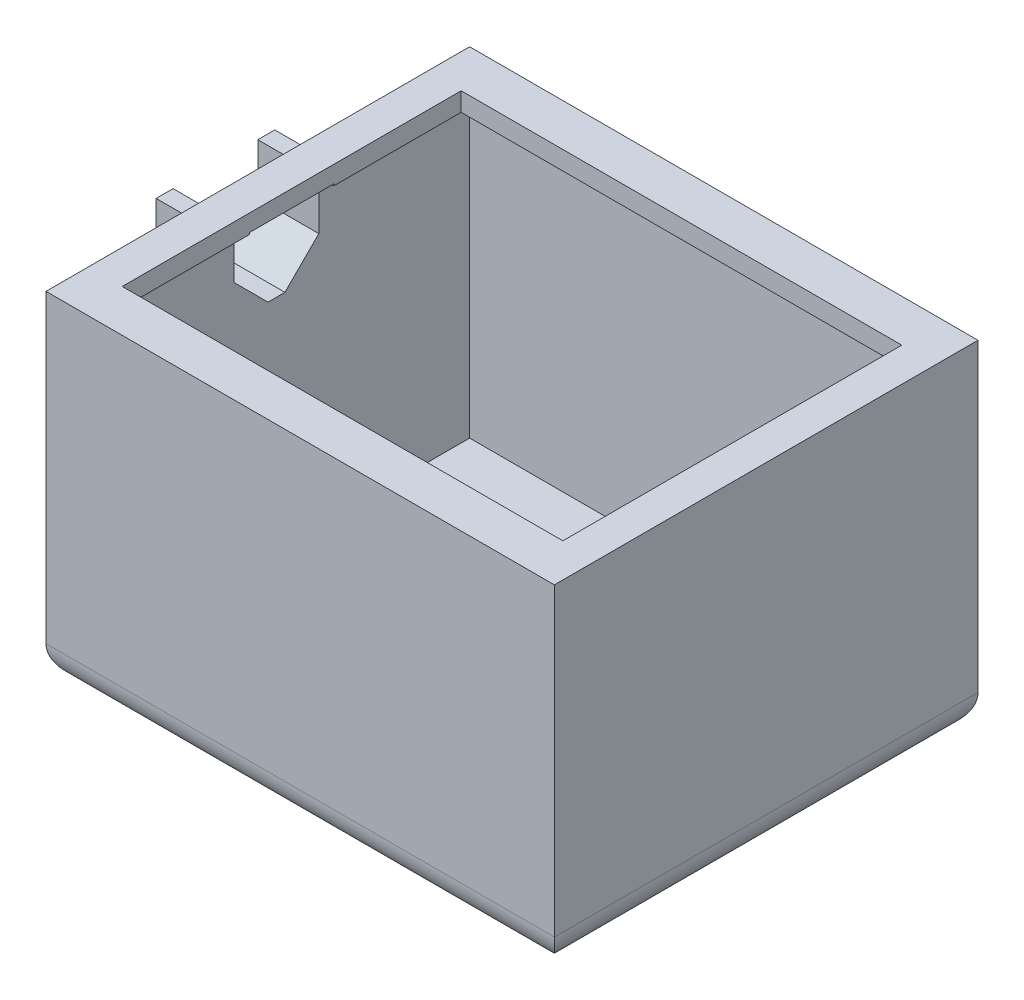
ISO-10303-21;
HEADER;
FILE_DESCRIPTION(('STEP AP214'),'2;1');
FILE_NAME('part.step','',(''),(''),'','','');
FILE_SCHEMA(('AUTOMOTIVE_DESIGN { 1 0 10303 214 1 1 1 1 }'));
ENDSEC;
DATA;
#1=APPLICATION_CONTEXT('core data for automotive mechanical design processes');
#2=APPLICATION_PROTOCOL_DEFINITION('international standard','automotive_design',2000,#1);
#3=PRODUCT_CONTEXT('',#1,'mechanical');
#4=PRODUCT('Part','Part','',(#3));
#5=PRODUCT_RELATED_PRODUCT_CATEGORY('part','',(#4));
#6=PRODUCT_DEFINITION_FORMATION('','',#4);
#7=PRODUCT_DEFINITION_CONTEXT('part definition',#1,'design');
#8=PRODUCT_DEFINITION('design','',#6,#7);
#9=PRODUCT_DEFINITION_SHAPE('','',#8);
#10=(LENGTH_UNIT() NAMED_UNIT(*) SI_UNIT(.MILLI.,.METRE.));
#11=(NAMED_UNIT(*) PLANE_ANGLE_UNIT() SI_UNIT($,.RADIAN.));
#12=(NAMED_UNIT(*) SI_UNIT($,.STERADIAN.) SOLID_ANGLE_UNIT());
#13=UNCERTAINTY_MEASURE_WITH_UNIT(LENGTH_MEASURE(1.E-05),#10,'distance_accuracy_value','');
#14=(GEOMETRIC_REPRESENTATION_CONTEXT(3) GLOBAL_UNCERTAINTY_ASSIGNED_CONTEXT((#13)) GLOBAL_UNIT_ASSIGNED_CONTEXT((#10,
#11,#12)) REPRESENTATION_CONTEXT('',''));
#15=CARTESIAN_POINT('',(0.,0.,0.));
#16=DIRECTION('',(0.,0.,1.));
#17=DIRECTION('',(1.,0.,0.));
#18=AXIS2_PLACEMENT_3D('',#15,#16,#17);
#19=CARTESIAN_POINT('',(-27.8,40.,-25.));
#20=DIRECTION('',(1.,0.,0.));
#21=DIRECTION('',(0.,0.,-1.));
#22=AXIS2_PLACEMENT_3D('',#19,#20,#21);
#23=PLANE('',#22);
#24=DIRECTION('',(0.,-1.,0.));
#25=VECTOR('',#24,1.);
#26=CARTESIAN_POINT('',(-27.8,40.,-4.99999999999999));
#27=LINE('',#26,#25);
#28=CARTESIAN_POINT('',(-27.8,37.8,-5.));
#29=VERTEX_POINT('',#28);
#30=CARTESIAN_POINT('',(-27.8,32.,-4.99999999999999));
#31=VERTEX_POINT('',#30);
#32=EDGE_CURVE('E317',#29,#31,#27,.T.);
#33=ORIENTED_EDGE('',*,*,#32,.T.);
#34=DIRECTION('',(0.,0.707106781186545,-0.70710678118655));
#35=VECTOR('',#34,1.);
#36=CARTESIAN_POINT('',(-27.8,28.,-0.999999999999965));
#37=LINE('',#36,#35);
#38=CARTESIAN_POINT('',(-27.8,28.,-0.999999999999963));
#39=VERTEX_POINT('',#38);
#40=EDGE_CURVE('E476',#31,#39,#37,.F.);
#41=ORIENTED_EDGE('',*,*,#40,.T.);
#42=DIRECTION('',(0.,0.,1.));
#43=VECTOR('',#42,1.);
#44=CARTESIAN_POINT('',(-27.8,28.,-25.));
#45=LINE('',#44,#43);
#46=CARTESIAN_POINT('',(-27.8,28.,1.));
#47=VERTEX_POINT('',#46);
#48=EDGE_CURVE('E321',#39,#47,#45,.T.);
#49=ORIENTED_EDGE('',*,*,#48,.T.);
#50=DIRECTION('',(0.,-0.707106781186551,-0.707106781186544));
#51=VECTOR('',#50,1.);
#52=CARTESIAN_POINT('',(-27.8,32.,5.));
#53=LINE('',#52,#51);
#54=CARTESIAN_POINT('',(-27.8,32.,5.));
#55=VERTEX_POINT('',#54);
#56=EDGE_CURVE('E482',#47,#55,#53,.F.);
#57=ORIENTED_EDGE('',*,*,#56,.T.);
#58=DIRECTION('',(0.,1.,0.));
#59=VECTOR('',#58,1.);
#60=CARTESIAN_POINT('',(-27.8,40.,5.));
#61=LINE('',#60,#59);
#62=CARTESIAN_POINT('',(-27.8,37.8,5.));
#63=VERTEX_POINT('',#62);
#64=EDGE_CURVE('E332',#55,#63,#61,.T.);
#65=ORIENTED_EDGE('',*,*,#64,.T.);
#66=DIRECTION('',(0.,0.,1.));
#67=VECTOR('',#66,1.);
#68=CARTESIAN_POINT('',(-27.8,37.8,-25.));
#69=LINE('',#68,#67);
#70=CARTESIAN_POINT('',(-27.8,37.8,22.8));
#71=VERTEX_POINT('',#70);
#72=EDGE_CURVE('E398',#63,#71,#69,.T.);
#73=ORIENTED_EDGE('',*,*,#72,.T.);
#74=DIRECTION('',(0.,-1.,0.));
#75=VECTOR('',#74,1.);
#76=CARTESIAN_POINT('',(-27.8,40.,22.8));
#77=LINE('',#76,#75);
#78=CARTESIAN_POINT('',(-27.8,2.2,22.8));
#79=VERTEX_POINT('',#78);
#80=EDGE_CURVE('E406',#71,#79,#77,.T.);
#81=ORIENTED_EDGE('',*,*,#80,.T.);
#82=DIRECTION('',(0.,0.,1.));
#83=VECTOR('',#82,1.);
#84=CARTESIAN_POINT('',(-27.8,2.2,-25.));
#85=LINE('',#84,#83);
#86=CARTESIAN_POINT('',(-27.8,2.2,-22.8));
#87=VERTEX_POINT('',#86);
#88=EDGE_CURVE('E417',#87,#79,#85,.T.);
#89=ORIENTED_EDGE('',*,*,#88,.F.);
#90=DIRECTION('',(0.,-1.,0.));
#91=VECTOR('',#90,1.);
#92=CARTESIAN_POINT('',(-27.8,40.,-22.8));
#93=LINE('',#92,#91);
#94=CARTESIAN_POINT('',(-27.8,37.8,-22.8));
#95=VERTEX_POINT('',#94);
#96=EDGE_CURVE('E413',#95,#87,#93,.T.);
#97=ORIENTED_EDGE('',*,*,#96,.F.);
#98=EDGE_CURVE('E394',#95,#29,#69,.T.);
#99=ORIENTED_EDGE('',*,*,#98,.T.);
#100=EDGE_LOOP('',(#33,#41,#49,#57,#65,#73,#81,#89,#97,#99));
#101=FACE_BOUND('',#100,.T.);
#102=ADVANCED_FACE('F41',(#101),#23,.T.);
#103=CARTESIAN_POINT('',(0.,37.8,0.));
#104=DIRECTION('',(0.,1.,0.));
#105=DIRECTION('',(0.,0.,1.));
#106=AXIS2_PLACEMENT_3D('',#103,#104,#105);
#107=PLANE('',#106);
#108=DIRECTION('',(-1.,0.,0.));
#109=VECTOR('',#108,1.);
#110=CARTESIAN_POINT('',(0.,37.8,5.));
#111=LINE('',#110,#109);
#112=CARTESIAN_POINT('',(-26.,37.8,5.00000000000001));
#113=VERTEX_POINT('',#112);
#114=EDGE_CURVE('E328',#113,#63,#111,.T.);
#115=ORIENTED_EDGE('',*,*,#114,.F.);
#116=DIRECTION('',(0.,0.,1.));
#117=VECTOR('',#116,1.);
#118=CARTESIAN_POINT('',(-26.,37.8,0.));
#119=LINE('',#118,#117);
#120=CARTESIAN_POINT('',(-26.,37.8,20.));
#121=VERTEX_POINT('',#120);
#122=EDGE_CURVE('E437',#113,#121,#119,.T.);
#123=ORIENTED_EDGE('',*,*,#122,.T.);
#124=DIRECTION('',(1.,0.,0.));
#125=VECTOR('',#124,1.);
#126=CARTESIAN_POINT('',(0.,37.8,20.));
#127=LINE('',#126,#125);
#128=CARTESIAN_POINT('',(26.,37.8,20.));
#129=VERTEX_POINT('',#128);
#130=EDGE_CURVE('E442',#121,#129,#127,.T.);
#131=ORIENTED_EDGE('',*,*,#130,.T.);
#132=DIRECTION('',(0.,0.,-1.));
#133=VECTOR('',#132,1.);
#134=CARTESIAN_POINT('',(26.,37.8,0.));
#135=LINE('',#134,#133);
#136=CARTESIAN_POINT('',(26.,37.8,-20.));
#137=VERTEX_POINT('',#136);
#138=EDGE_CURVE('E446',#129,#137,#135,.T.);
#139=ORIENTED_EDGE('',*,*,#138,.T.);
#140=DIRECTION('',(-1.,0.,0.));
#141=VECTOR('',#140,1.);
#142=CARTESIAN_POINT('',(0.,37.8,-20.));
#143=LINE('',#142,#141);
#144=CARTESIAN_POINT('',(-26.,37.8,-20.));
#145=VERTEX_POINT('',#144);
#146=EDGE_CURVE('E393',#137,#145,#143,.T.);
#147=ORIENTED_EDGE('',*,*,#146,.T.);
#148=CARTESIAN_POINT('',(-26.,37.8,-4.99999999999999));
#149=VERTEX_POINT('',#148);
#150=EDGE_CURVE('E438',#145,#149,#119,.T.);
#151=ORIENTED_EDGE('',*,*,#150,.T.);
#152=DIRECTION('',(1.,0.,0.));
#153=VECTOR('',#152,1.);
#154=CARTESIAN_POINT('',(0.,37.8,-5.));
#155=LINE('',#154,#153);
#156=EDGE_CURVE('E314',#29,#149,#155,.T.);
#157=ORIENTED_EDGE('',*,*,#156,.F.);
#158=ORIENTED_EDGE('',*,*,#98,.F.);
#159=DIRECTION('',(-1.,0.,0.));
#160=VECTOR('',#159,1.);
#161=CARTESIAN_POINT('',(-30.,37.8,-22.8));
#162=LINE('',#161,#160);
#163=CARTESIAN_POINT('',(27.8,37.8,-22.8));
#164=VERTEX_POINT('',#163);
#165=EDGE_CURVE('E399',#164,#95,#162,.T.);
#166=ORIENTED_EDGE('',*,*,#165,.F.);
#167=DIRECTION('',(0.,0.,-1.));
#168=VECTOR('',#167,1.);
#169=CARTESIAN_POINT('',(27.8,37.8,-25.));
#170=LINE('',#169,#168);
#171=CARTESIAN_POINT('',(27.8,37.8,22.8));
#172=VERTEX_POINT('',#171);
#173=EDGE_CURVE('E402',#172,#164,#170,.T.);
#174=ORIENTED_EDGE('',*,*,#173,.F.);
#175=DIRECTION('',(1.,0.,0.));
#176=VECTOR('',#175,1.);
#177=CARTESIAN_POINT('',(-30.,37.8,22.8));
#178=LINE('',#177,#176);
#179=EDGE_CURVE('E390',#71,#172,#178,.T.);
#180=ORIENTED_EDGE('',*,*,#179,.F.);
#181=ORIENTED_EDGE('',*,*,#72,.F.);
#182=EDGE_LOOP('',(#115,#123,#131,#139,#147,#151,#157,#158,#166,#174,#180,#181));
#183=FACE_BOUND('',#182,.T.);
#184=ADVANCED_FACE('F562',(#183),#107,.F.);
#185=CARTESIAN_POINT('',(-26.,30.,-20.));
#186=DIRECTION('',(-1.,0.,0.));
#187=DIRECTION('',(0.,0.,1.));
#188=AXIS2_PLACEMENT_3D('',#185,#186,#187);
#189=PLANE('',#188);
#190=DIRECTION('',(0.,-1.,0.));
#191=VECTOR('',#190,1.);
#192=CARTESIAN_POINT('',(-26.,30.,5.));
#193=LINE('',#192,#191);
#194=CARTESIAN_POINT('',(-26.,38.,5.));
#195=VERTEX_POINT('',#194);
#196=EDGE_CURVE('E325',#195,#113,#193,.T.);
#197=ORIENTED_EDGE('',*,*,#196,.F.);
#198=DIRECTION('',(0.,0.,1.));
#199=VECTOR('',#198,1.);
#200=CARTESIAN_POINT('',(-26.,38.,-20.));
#201=LINE('',#200,#199);
#202=CARTESIAN_POINT('',(-26.,38.,-5.));
#203=VERTEX_POINT('',#202);
#204=EDGE_CURVE('E307',#203,#195,#201,.T.);
#205=ORIENTED_EDGE('',*,*,#204,.F.);
#206=DIRECTION('',(0.,1.,0.));
#207=VECTOR('',#206,1.);
#208=CARTESIAN_POINT('',(-26.,30.,-5.));
#209=LINE('',#208,#207);
#210=EDGE_CURVE('E310',#149,#203,#209,.T.);
#211=ORIENTED_EDGE('',*,*,#210,.F.);
#212=ORIENTED_EDGE('',*,*,#150,.F.);
#213=DIRECTION('',(0.,1.,0.));
#214=VECTOR('',#213,1.);
#215=CARTESIAN_POINT('',(-26.,30.,-20.));
#216=LINE('',#215,#214);
#217=CARTESIAN_POINT('',(-26.,40.,-20.));
#218=VERTEX_POINT('',#217);
#219=EDGE_CURVE('E358',#145,#218,#216,.T.);
#220=ORIENTED_EDGE('',*,*,#219,.T.);
#221=DIRECTION('',(0.,0.,1.));
#222=VECTOR('',#221,1.);
#223=CARTESIAN_POINT('',(-26.,40.,-20.));
#224=LINE('',#223,#222);
#225=CARTESIAN_POINT('',(-26.,40.,20.));
#226=VERTEX_POINT('',#225);
#227=EDGE_CURVE('E342',#218,#226,#224,.T.);
#228=ORIENTED_EDGE('',*,*,#227,.T.);
#229=DIRECTION('',(0.,1.,0.));
#230=VECTOR('',#229,1.);
#231=CARTESIAN_POINT('',(-26.,30.,20.));
#232=LINE('',#231,#230);
#233=EDGE_CURVE('E355',#121,#226,#232,.T.);
#234=ORIENTED_EDGE('',*,*,#233,.F.);
#235=ORIENTED_EDGE('',*,*,#122,.F.);
#236=EDGE_LOOP('',(#197,#205,#211,#212,#220,#228,#234,#235));
#237=FACE_BOUND('',#236,.T.);
#238=ADVANCED_FACE('F568',(#237),#189,.F.);
#239=CARTESIAN_POINT('',(-30.,40.,-25.));
#240=DIRECTION('',(1.,0.,0.));
#241=DIRECTION('',(0.,0.,-1.));
#242=AXIS2_PLACEMENT_3D('',#239,#240,#241);
#243=PLANE('',#242);
#244=DIRECTION('',(0.,-1.,0.));
#245=VECTOR('',#244,1.);
#246=CARTESIAN_POINT('',(-30.,40.,-25.));
#247=LINE('',#246,#245);
#248=CARTESIAN_POINT('',(-30.,40.,-25.));
#249=VERTEX_POINT('',#248);
#250=CARTESIAN_POINT('',(-30.,4.,-25.));
#251=VERTEX_POINT('',#250);
#252=EDGE_CURVE('E382',#249,#251,#247,.T.);
#253=ORIENTED_EDGE('',*,*,#252,.T.);
#254=DIRECTION('',(0.,0.,1.));
#255=VECTOR('',#254,1.);
#256=CARTESIAN_POINT('',(-30.,4.,-25.));
#257=LINE('',#256,#255);
#258=CARTESIAN_POINT('',(-30.,4.,25.));
#259=VERTEX_POINT('',#258);
#260=EDGE_CURVE('E51',#251,#259,#257,.T.);
#261=ORIENTED_EDGE('',*,*,#260,.T.);
#262=DIRECTION('',(0.,-1.,0.));
#263=VECTOR('',#262,1.);
#264=CARTESIAN_POINT('',(-30.,40.,25.));
#265=LINE('',#264,#263);
#266=CARTESIAN_POINT('',(-30.,40.,25.));
#267=VERTEX_POINT('',#266);
#268=EDGE_CURVE('E379',#267,#259,#265,.T.);
#269=ORIENTED_EDGE('',*,*,#268,.F.);
#270=DIRECTION('',(0.,0.,1.));
#271=VECTOR('',#270,1.);
#272=CARTESIAN_POINT('',(-30.,40.,-25.));
#273=LINE('',#272,#271);
#274=EDGE_CURVE('E370',#249,#267,#273,.T.);
#275=ORIENTED_EDGE('',*,*,#274,.F.);
#276=EDGE_LOOP('',(#253,#261,#269,#275));
#277=FACE_BOUND('',#276,.T.);
#278=DIRECTION('',(0.,0.,-1.));
#279=VECTOR('',#278,1.);
#280=CARTESIAN_POINT('',(-30.,21.,-25.));
#281=LINE('',#280,#279);
#282=CARTESIAN_POINT('',(-30.,21.,7.00000000000001));
#283=VERTEX_POINT('',#282);
#284=CARTESIAN_POINT('',(-30.,21.,-6.99999999999999));
#285=VERTEX_POINT('',#284);
#286=EDGE_CURVE('E450',#283,#285,#281,.T.);
#287=ORIENTED_EDGE('',*,*,#286,.T.);
#288=DIRECTION('',(0.,1.,0.));
#289=VECTOR('',#288,1.);
#290=CARTESIAN_POINT('',(-30.,26.,-6.99999999999999));
#291=LINE('',#290,#289);
#292=CARTESIAN_POINT('',(-30.,38.,-6.99999999999999));
#293=VERTEX_POINT('',#292);
#294=EDGE_CURVE('E281',#285,#293,#291,.T.);
#295=ORIENTED_EDGE('',*,*,#294,.T.);
#296=DIRECTION('',(0.,0.,1.));
#297=VECTOR('',#296,1.);
#298=CARTESIAN_POINT('',(-30.,38.,-6.99999999999999));
#299=LINE('',#298,#297);
#300=CARTESIAN_POINT('',(-30.,38.,-4.99999999999999));
#301=VERTEX_POINT('',#300);
#302=EDGE_CURVE('E236',#293,#301,#299,.T.);
#303=ORIENTED_EDGE('',*,*,#302,.T.);
#304=DIRECTION('',(0.,0.,1.));
#305=VECTOR('',#304,1.);
#306=CARTESIAN_POINT('',(-30.,38.,-4.99999999999999));
#307=LINE('',#306,#305);
#308=CARTESIAN_POINT('',(-30.,38.,5.));
#309=VERTEX_POINT('',#308);
#310=EDGE_CURVE('E291',#301,#309,#307,.T.);
#311=ORIENTED_EDGE('',*,*,#310,.T.);
#312=DIRECTION('',(0.,0.,1.));
#313=VECTOR('',#312,1.);
#314=CARTESIAN_POINT('',(-30.,38.,5.));
#315=LINE('',#314,#313);
#316=CARTESIAN_POINT('',(-30.,38.,7.00000000000001));
#317=VERTEX_POINT('',#316);
#318=EDGE_CURVE('E242',#309,#317,#315,.T.);
#319=ORIENTED_EDGE('',*,*,#318,.T.);
#320=DIRECTION('',(0.,-1.,0.));
#321=VECTOR('',#320,1.);
#322=CARTESIAN_POINT('',(-30.,38.,7.00000000000001));
#323=LINE('',#322,#321);
#324=EDGE_CURVE('E278',#317,#283,#323,.T.);
#325=ORIENTED_EDGE('',*,*,#324,.T.);
#326=EDGE_LOOP('',(#287,#295,#303,#311,#319,#325));
#327=FACE_BOUND('',#326,.T.);
#328=ADVANCED_FACE('F541',(#277,#327),#243,.F.);
#329=CARTESIAN_POINT('',(27.8,40.,-25.));
#330=DIRECTION('',(-1.,0.,0.));
#331=DIRECTION('',(0.,0.,1.));
#332=AXIS2_PLACEMENT_3D('',#329,#330,#331);
#333=PLANE('',#332);
#334=DIRECTION('',(0.,0.,-1.));
#335=VECTOR('',#334,1.);
#336=CARTESIAN_POINT('',(27.8,2.2,-25.));
#337=LINE('',#336,#335);
#338=CARTESIAN_POINT('',(27.8,2.2,22.8));
#339=VERTEX_POINT('',#338);
#340=CARTESIAN_POINT('',(27.8,2.2,-22.8));
#341=VERTEX_POINT('',#340);
#342=EDGE_CURVE('E389',#339,#341,#337,.T.);
#343=ORIENTED_EDGE('',*,*,#342,.F.);
#344=DIRECTION('',(0.,-1.,0.));
#345=VECTOR('',#344,1.);
#346=CARTESIAN_POINT('',(27.8,40.,22.8));
#347=LINE('',#346,#345);
#348=EDGE_CURVE('E427',#172,#339,#347,.T.);
#349=ORIENTED_EDGE('',*,*,#348,.F.);
#350=ORIENTED_EDGE('',*,*,#173,.T.);
#351=DIRECTION('',(0.,-1.,0.));
#352=VECTOR('',#351,1.);
#353=CARTESIAN_POINT('',(27.8,40.,-22.8));
#354=LINE('',#353,#352);
#355=EDGE_CURVE('E420',#164,#341,#354,.T.);
#356=ORIENTED_EDGE('',*,*,#355,.T.);
#357=EDGE_LOOP('',(#343,#349,#350,#356));
#358=FACE_BOUND('',#357,.T.);
#359=ADVANCED_FACE('F733',(#358),#333,.T.);
#360=CARTESIAN_POINT('',(-30.,40.,-22.8));
#361=DIRECTION('',(0.,0.,1.));
#362=DIRECTION('',(1.,0.,0.));
#363=AXIS2_PLACEMENT_3D('',#360,#361,#362);
#364=PLANE('',#363);
#365=DIRECTION('',(-1.,0.,0.));
#366=VECTOR('',#365,1.);
#367=CARTESIAN_POINT('',(-30.,2.2,-22.8));
#368=LINE('',#367,#366);
#369=EDGE_CURVE('E424',#341,#87,#368,.T.);
#370=ORIENTED_EDGE('',*,*,#369,.F.);
#371=ORIENTED_EDGE('',*,*,#355,.F.);
#372=ORIENTED_EDGE('',*,*,#165,.T.);
#373=ORIENTED_EDGE('',*,*,#96,.T.);
#374=EDGE_LOOP('',(#370,#371,#372,#373));
#375=FACE_BOUND('',#374,.T.);
#376=ADVANCED_FACE('F573',(#375),#364,.T.);
#377=CARTESIAN_POINT('',(-30.,40.,22.8));
#378=DIRECTION('',(0.,0.,-1.));
#379=DIRECTION('',(-1.,0.,0.));
#380=AXIS2_PLACEMENT_3D('',#377,#378,#379);
#381=PLANE('',#380);
#382=DIRECTION('',(1.,0.,0.));
#383=VECTOR('',#382,1.);
#384=CARTESIAN_POINT('',(-30.,2.2,22.8));
#385=LINE('',#384,#383);
#386=EDGE_CURVE('E410',#79,#339,#385,.T.);
#387=ORIENTED_EDGE('',*,*,#386,.F.);
#388=ORIENTED_EDGE('',*,*,#80,.F.);
#389=ORIENTED_EDGE('',*,*,#179,.T.);
#390=ORIENTED_EDGE('',*,*,#348,.T.);
#391=EDGE_LOOP('',(#387,#388,#389,#390));
#392=FACE_BOUND('',#391,.T.);
#393=ADVANCED_FACE('F575',(#392),#381,.T.);
#394=CARTESIAN_POINT('',(0.,2.2,0.));
#395=DIRECTION('',(0.,1.,0.));
#396=DIRECTION('',(0.,0.,1.));
#397=AXIS2_PLACEMENT_3D('',#394,#395,#396);
#398=PLANE('',#397);
#399=ORIENTED_EDGE('',*,*,#342,.T.);
#400=ORIENTED_EDGE('',*,*,#369,.T.);
#401=ORIENTED_EDGE('',*,*,#88,.T.);
#402=ORIENTED_EDGE('',*,*,#386,.T.);
#403=EDGE_LOOP('',(#399,#400,#401,#402));
#404=FACE_BOUND('',#403,.T.);
#405=ADVANCED_FACE('F577',(#404),#398,.T.);
#406=CARTESIAN_POINT('',(26.,30.,-20.));
#407=DIRECTION('',(1.,0.,0.));
#408=DIRECTION('',(0.,0.,-1.));
#409=AXIS2_PLACEMENT_3D('',#406,#407,#408);
#410=PLANE('',#409);
#411=DIRECTION('',(0.,1.,0.));
#412=VECTOR('',#411,1.);
#413=CARTESIAN_POINT('',(26.,30.,20.));
#414=LINE('',#413,#412);
#415=CARTESIAN_POINT('',(26.,40.,20.));
#416=VERTEX_POINT('',#415);
#417=EDGE_CURVE('E351',#129,#416,#414,.T.);
#418=ORIENTED_EDGE('',*,*,#417,.T.);
#419=DIRECTION('',(0.,0.,-1.));
#420=VECTOR('',#419,1.);
#421=CARTESIAN_POINT('',(26.,40.,-20.));
#422=LINE('',#421,#420);
#423=CARTESIAN_POINT('',(26.,40.,-20.));
#424=VERTEX_POINT('',#423);
#425=EDGE_CURVE('E335',#416,#424,#422,.T.);
#426=ORIENTED_EDGE('',*,*,#425,.T.);
#427=DIRECTION('',(0.,1.,0.));
#428=VECTOR('',#427,1.);
#429=CARTESIAN_POINT('',(26.,30.,-20.));
#430=LINE('',#429,#428);
#431=EDGE_CURVE('E350',#137,#424,#430,.T.);
#432=ORIENTED_EDGE('',*,*,#431,.F.);
#433=ORIENTED_EDGE('',*,*,#138,.F.);
#434=EDGE_LOOP('',(#418,#426,#432,#433));
#435=FACE_BOUND('',#434,.T.);
#436=ADVANCED_FACE('F582',(#435),#410,.F.);
#437=CARTESIAN_POINT('',(-26.,30.,20.));
#438=DIRECTION('',(0.,0.,1.));
#439=DIRECTION('',(1.,0.,0.));
#440=AXIS2_PLACEMENT_3D('',#437,#438,#439);
#441=PLANE('',#440);
#442=ORIENTED_EDGE('',*,*,#233,.T.);
#443=DIRECTION('',(1.,0.,0.));
#444=VECTOR('',#443,1.);
#445=CARTESIAN_POINT('',(-26.,40.,20.));
#446=LINE('',#445,#444);
#447=EDGE_CURVE('E346',#226,#416,#446,.T.);
#448=ORIENTED_EDGE('',*,*,#447,.T.);
#449=ORIENTED_EDGE('',*,*,#417,.F.);
#450=ORIENTED_EDGE('',*,*,#130,.F.);
#451=EDGE_LOOP('',(#442,#448,#449,#450));
#452=FACE_BOUND('',#451,.T.);
#453=ADVANCED_FACE('F759',(#452),#441,.F.);
#454=CARTESIAN_POINT('',(-26.,30.,-20.));
#455=DIRECTION('',(0.,0.,-1.));
#456=DIRECTION('',(-1.,0.,0.));
#457=AXIS2_PLACEMENT_3D('',#454,#455,#456);
#458=PLANE('',#457);
#459=ORIENTED_EDGE('',*,*,#431,.T.);
#460=DIRECTION('',(-1.,0.,0.));
#461=VECTOR('',#460,1.);
#462=CARTESIAN_POINT('',(-26.,40.,-20.));
#463=LINE('',#462,#461);
#464=EDGE_CURVE('E338',#424,#218,#463,.T.);
#465=ORIENTED_EDGE('',*,*,#464,.T.);
#466=ORIENTED_EDGE('',*,*,#219,.F.);
#467=ORIENTED_EDGE('',*,*,#146,.F.);
#468=EDGE_LOOP('',(#459,#465,#466,#467));
#469=FACE_BOUND('',#468,.T.);
#470=ADVANCED_FACE('F710',(#469),#458,.F.);
#471=CARTESIAN_POINT('',(30.,40.,-25.));
#472=DIRECTION('',(-1.,0.,0.));
#473=DIRECTION('',(0.,0.,1.));
#474=AXIS2_PLACEMENT_3D('',#471,#472,#473);
#475=PLANE('',#474);
#476=DIRECTION('',(0.,-1.,0.));
#477=VECTOR('',#476,1.);
#478=CARTESIAN_POINT('',(30.,40.,25.));
#479=LINE('',#478,#477);
#480=CARTESIAN_POINT('',(30.,40.,25.));
#481=VERTEX_POINT('',#480);
#482=CARTESIAN_POINT('',(30.,4.,25.));
#483=VERTEX_POINT('',#482);
#484=EDGE_CURVE('E376',#481,#483,#479,.T.);
#485=ORIENTED_EDGE('',*,*,#484,.T.);
#486=DIRECTION('',(0.,0.,-1.));
#487=VECTOR('',#486,1.);
#488=CARTESIAN_POINT('',(30.,4.,-25.));
#489=LINE('',#488,#487);
#490=CARTESIAN_POINT('',(30.,4.,-25.));
#491=VERTEX_POINT('',#490);
#492=EDGE_CURVE('E502',#483,#491,#489,.T.);
#493=ORIENTED_EDGE('',*,*,#492,.T.);
#494=DIRECTION('',(0.,-1.,0.));
#495=VECTOR('',#494,1.);
#496=CARTESIAN_POINT('',(30.,40.,-25.));
#497=LINE('',#496,#495);
#498=CARTESIAN_POINT('',(30.,40.,-25.));
#499=VERTEX_POINT('',#498);
#500=EDGE_CURVE('E385',#499,#491,#497,.T.);
#501=ORIENTED_EDGE('',*,*,#500,.F.);
#502=DIRECTION('',(0.,0.,-1.));
#503=VECTOR('',#502,1.);
#504=CARTESIAN_POINT('',(30.,40.,-25.));
#505=LINE('',#504,#503);
#506=EDGE_CURVE('E354',#481,#499,#505,.T.);
#507=ORIENTED_EDGE('',*,*,#506,.F.);
#508=EDGE_LOOP('',(#485,#493,#501,#507));
#509=FACE_BOUND('',#508,.T.);
#510=ADVANCED_FACE('F548',(#509),#475,.F.);
#511=CARTESIAN_POINT('',(-30.,40.,-25.));
#512=DIRECTION('',(0.,0.,1.));
#513=DIRECTION('',(1.,0.,0.));
#514=AXIS2_PLACEMENT_3D('',#511,#512,#513);
#515=PLANE('',#514);
#516=ORIENTED_EDGE('',*,*,#500,.T.);
#517=DIRECTION('',(-1.,0.,0.));
#518=VECTOR('',#517,1.);
#519=CARTESIAN_POINT('',(-30.,4.,-25.));
#520=LINE('',#519,#518);
#521=EDGE_CURVE('E485',#491,#251,#520,.T.);
#522=ORIENTED_EDGE('',*,*,#521,.T.);
#523=ORIENTED_EDGE('',*,*,#252,.F.);
#524=DIRECTION('',(-1.,0.,0.));
#525=VECTOR('',#524,1.);
#526=CARTESIAN_POINT('',(-30.,40.,-25.));
#527=LINE('',#526,#525);
#528=EDGE_CURVE('E367',#499,#249,#527,.T.);
#529=ORIENTED_EDGE('',*,*,#528,.F.);
#530=EDGE_LOOP('',(#516,#522,#523,#529));
#531=FACE_BOUND('',#530,.T.);
#532=ADVANCED_FACE('F538',(#531),#515,.F.);
#533=CARTESIAN_POINT('',(-30.,40.,25.));
#534=DIRECTION('',(0.,0.,-1.));
#535=DIRECTION('',(-1.,0.,0.));
#536=AXIS2_PLACEMENT_3D('',#533,#534,#535);
#537=PLANE('',#536);
#538=ORIENTED_EDGE('',*,*,#268,.T.);
#539=DIRECTION('',(1.,0.,0.));
#540=VECTOR('',#539,1.);
#541=CARTESIAN_POINT('',(-30.,4.,25.));
#542=LINE('',#541,#540);
#543=EDGE_CURVE('E11',#259,#483,#542,.T.);
#544=ORIENTED_EDGE('',*,*,#543,.T.);
#545=ORIENTED_EDGE('',*,*,#484,.F.);
#546=DIRECTION('',(1.,0.,0.));
#547=VECTOR('',#546,1.);
#548=CARTESIAN_POINT('',(-30.,40.,25.));
#549=LINE('',#548,#547);
#550=EDGE_CURVE('E373',#267,#481,#549,.T.);
#551=ORIENTED_EDGE('',*,*,#550,.F.);
#552=EDGE_LOOP('',(#538,#544,#545,#551));
#553=FACE_BOUND('',#552,.T.);
#554=ADVANCED_FACE('F549',(#553),#537,.F.);
#555=CARTESIAN_POINT('',(0.,40.,0.));
#556=DIRECTION('',(0.,1.,0.));
#557=DIRECTION('',(0.,0.,1.));
#558=AXIS2_PLACEMENT_3D('',#555,#556,#557);
#559=PLANE('',#558);
#560=ORIENTED_EDGE('',*,*,#425,.F.);
#561=ORIENTED_EDGE('',*,*,#447,.F.);
#562=ORIENTED_EDGE('',*,*,#227,.F.);
#563=ORIENTED_EDGE('',*,*,#464,.F.);
#564=EDGE_LOOP('',(#560,#561,#562,#563));
#565=FACE_BOUND('',#564,.T.);
#566=ORIENTED_EDGE('',*,*,#506,.T.);
#567=ORIENTED_EDGE('',*,*,#528,.T.);
#568=ORIENTED_EDGE('',*,*,#274,.T.);
#569=ORIENTED_EDGE('',*,*,#550,.T.);
#570=EDGE_LOOP('',(#566,#567,#568,#569));
#571=FACE_BOUND('',#570,.T.);
#572=ADVANCED_FACE('F545',(#565,#571),#559,.T.);
#573=CARTESIAN_POINT('',(0.,0.,0.));
#574=DIRECTION('',(0.,1.,0.));
#575=DIRECTION('',(0.,0.,1.));
#576=AXIS2_PLACEMENT_3D('',#573,#574,#575);
#577=PLANE('',#576);
#578=DIRECTION('',(0.,0.,1.));
#579=VECTOR('',#578,1.);
#580=CARTESIAN_POINT('',(-26.,0.,0.));
#581=LINE('',#580,#579);
#582=CARTESIAN_POINT('',(-26.,0.,21.));
#583=VERTEX_POINT('',#582);
#584=CARTESIAN_POINT('',(-26.,0.,-21.));
#585=VERTEX_POINT('',#584);
#586=EDGE_CURVE('E492',#583,#585,#581,.F.);
#587=ORIENTED_EDGE('',*,*,#586,.T.);
#588=DIRECTION('',(-1.,0.,0.));
#589=VECTOR('',#588,1.);
#590=CARTESIAN_POINT('',(0.,0.,-21.));
#591=LINE('',#590,#589);
#592=CARTESIAN_POINT('',(26.,0.,-21.));
#593=VERTEX_POINT('',#592);
#594=EDGE_CURVE('E498',#585,#593,#591,.F.);
#595=ORIENTED_EDGE('',*,*,#594,.T.);
#596=DIRECTION('',(0.,0.,-1.));
#597=VECTOR('',#596,1.);
#598=CARTESIAN_POINT('',(26.,0.,0.));
#599=LINE('',#598,#597);
#600=CARTESIAN_POINT('',(26.,0.,21.));
#601=VERTEX_POINT('',#600);
#602=EDGE_CURVE('E495',#593,#601,#599,.F.);
#603=ORIENTED_EDGE('',*,*,#602,.T.);
#604=DIRECTION('',(1.,0.,0.));
#605=VECTOR('',#604,1.);
#606=CARTESIAN_POINT('',(0.,0.,21.));
#607=LINE('',#606,#605);
#608=EDGE_CURVE('E489',#601,#583,#607,.F.);
#609=ORIENTED_EDGE('',*,*,#608,.T.);
#610=EDGE_LOOP('',(#587,#595,#603,#609));
#611=FACE_BOUND('',#610,.T.);
#612=ADVANCED_FACE('F529',(#611),#577,.F.);
#613=CARTESIAN_POINT('',(-25.,38.,-5.));
#614=DIRECTION('',(0.,-1.,0.));
#615=DIRECTION('',(0.,0.,-1.));
#616=AXIS2_PLACEMENT_3D('',#613,#614,#615);
#617=PLANE('',#616);
#618=ORIENTED_EDGE('',*,*,#204,.T.);
#619=DIRECTION('',(-1.,0.,0.));
#620=VECTOR('',#619,1.);
#621=CARTESIAN_POINT('',(-25.,38.,5.));
#622=LINE('',#621,#620);
#623=EDGE_CURVE('E300',#195,#309,#622,.T.);
#624=ORIENTED_EDGE('',*,*,#623,.T.);
#625=ORIENTED_EDGE('',*,*,#310,.F.);
#626=DIRECTION('',(-1.,0.,0.));
#627=VECTOR('',#626,1.);
#628=CARTESIAN_POINT('',(-25.,38.,-5.));
#629=LINE('',#628,#627);
#630=EDGE_CURVE('E303',#203,#301,#629,.T.);
#631=ORIENTED_EDGE('',*,*,#630,.F.);
#632=EDGE_LOOP('',(#618,#624,#625,#631));
#633=FACE_BOUND('',#632,.T.);
#634=ADVANCED_FACE('F687',(#633),#617,.T.);
#635=CARTESIAN_POINT('',(-25.,38.,5.));
#636=DIRECTION('',(0.,0.,-1.));
#637=DIRECTION('',(-1.,0.,0.));
#638=AXIS2_PLACEMENT_3D('',#635,#636,#637);
#639=PLANE('',#638);
#640=ORIENTED_EDGE('',*,*,#64,.F.);
#641=DIRECTION('',(-1.,0.,0.));
#642=VECTOR('',#641,1.);
#643=CARTESIAN_POINT('',(-35.,32.,5.00000000000001));
#644=LINE('',#643,#642);
#645=CARTESIAN_POINT('',(-35.,32.,5.00000000000001));
#646=VERTEX_POINT('',#645);
#647=EDGE_CURVE('E231',#55,#646,#644,.T.);
#648=ORIENTED_EDGE('',*,*,#647,.T.);
#649=DIRECTION('',(0.,1.,0.));
#650=VECTOR('',#649,1.);
#651=CARTESIAN_POINT('',(-35.,28.,5.00000000000001));
#652=LINE('',#651,#650);
#653=CARTESIAN_POINT('',(-35.,38.,5.00000000000001));
#654=VERTEX_POINT('',#653);
#655=EDGE_CURVE('E223',#646,#654,#652,.T.);
#656=ORIENTED_EDGE('',*,*,#655,.T.);
#657=DIRECTION('',(1.,0.,0.));
#658=VECTOR('',#657,1.);
#659=CARTESIAN_POINT('',(-35.,38.,5.00000000000001));
#660=LINE('',#659,#658);
#661=EDGE_CURVE('E228',#654,#309,#660,.T.);
#662=ORIENTED_EDGE('',*,*,#661,.T.);
#663=ORIENTED_EDGE('',*,*,#623,.F.);
#664=ORIENTED_EDGE('',*,*,#196,.T.);
#665=ORIENTED_EDGE('',*,*,#114,.T.);
#666=EDGE_LOOP('',(#640,#648,#656,#662,#663,#664,#665));
#667=FACE_BOUND('',#666,.T.);
#668=ADVANCED_FACE('F226',(#667),#639,.T.);
#669=CARTESIAN_POINT('',(-25.,28.,-5.));
#670=DIRECTION('',(0.,1.,0.));
#671=DIRECTION('',(0.,0.,1.));
#672=AXIS2_PLACEMENT_3D('',#669,#670,#671);
#673=PLANE('',#672);
#674=ORIENTED_EDGE('',*,*,#48,.F.);
#675=DIRECTION('',(-1.,0.,0.));
#676=VECTOR('',#675,1.);
#677=CARTESIAN_POINT('',(-35.,28.,-0.999999999999962));
#678=LINE('',#677,#676);
#679=CARTESIAN_POINT('',(-35.,28.,-0.999999999999963));
#680=VERTEX_POINT('',#679);
#681=EDGE_CURVE('E464',#39,#680,#678,.T.);
#682=ORIENTED_EDGE('',*,*,#681,.T.);
#683=DIRECTION('',(0.,0.,1.));
#684=VECTOR('',#683,1.);
#685=CARTESIAN_POINT('',(-35.,28.,-4.99999999999999));
#686=LINE('',#685,#684);
#687=CARTESIAN_POINT('',(-35.,28.,1.));
#688=VERTEX_POINT('',#687);
#689=EDGE_CURVE('E246',#680,#688,#686,.T.);
#690=ORIENTED_EDGE('',*,*,#689,.T.);
#691=DIRECTION('',(1.,0.,0.));
#692=VECTOR('',#691,1.);
#693=CARTESIAN_POINT('',(-27.8,28.,1.));
#694=LINE('',#693,#692);
#695=EDGE_CURVE('E461',#688,#47,#694,.T.);
#696=ORIENTED_EDGE('',*,*,#695,.T.);
#697=EDGE_LOOP('',(#674,#682,#690,#696));
#698=FACE_BOUND('',#697,.T.);
#699=ADVANCED_FACE('F672',(#698),#673,.T.);
#700=CARTESIAN_POINT('',(-25.,38.,-5.));
#701=DIRECTION('',(0.,0.,1.));
#702=DIRECTION('',(1.,0.,0.));
#703=AXIS2_PLACEMENT_3D('',#700,#701,#702);
#704=PLANE('',#703);
#705=DIRECTION('',(0.,-1.,0.));
#706=VECTOR('',#705,1.);
#707=CARTESIAN_POINT('',(-35.,38.,-4.99999999999999));
#708=LINE('',#707,#706);
#709=CARTESIAN_POINT('',(-35.,38.,-4.99999999999999));
#710=VERTEX_POINT('',#709);
#711=CARTESIAN_POINT('',(-35.,32.,-4.99999999999999));
#712=VERTEX_POINT('',#711);
#713=EDGE_CURVE('E269',#710,#712,#708,.T.);
#714=ORIENTED_EDGE('',*,*,#713,.T.);
#715=DIRECTION('',(1.,0.,0.));
#716=VECTOR('',#715,1.);
#717=CARTESIAN_POINT('',(-27.8,32.,-5.));
#718=LINE('',#717,#716);
#719=EDGE_CURVE('E468',#712,#31,#718,.T.);
#720=ORIENTED_EDGE('',*,*,#719,.T.);
#721=ORIENTED_EDGE('',*,*,#32,.F.);
#722=ORIENTED_EDGE('',*,*,#156,.T.);
#723=ORIENTED_EDGE('',*,*,#210,.T.);
#724=ORIENTED_EDGE('',*,*,#630,.T.);
#725=DIRECTION('',(1.,0.,0.));
#726=VECTOR('',#725,1.);
#727=CARTESIAN_POINT('',(-35.,38.,-4.99999999999999));
#728=LINE('',#727,#726);
#729=EDGE_CURVE('E288',#710,#301,#728,.T.);
#730=ORIENTED_EDGE('',*,*,#729,.F.);
#731=EDGE_LOOP('',(#714,#720,#721,#722,#723,#724,#730));
#732=FACE_BOUND('',#731,.T.);
#733=ADVANCED_FACE('F664',(#732),#704,.T.);
#734=CARTESIAN_POINT('',(-35.,38.,-6.99999999999999));
#735=DIRECTION('',(0.,1.,0.));
#736=DIRECTION('',(0.,0.,1.));
#737=AXIS2_PLACEMENT_3D('',#734,#735,#736);
#738=PLANE('',#737);
#739=ORIENTED_EDGE('',*,*,#302,.F.);
#740=DIRECTION('',(1.,0.,0.));
#741=VECTOR('',#740,1.);
#742=CARTESIAN_POINT('',(-35.,38.,-6.99999999999999));
#743=LINE('',#742,#741);
#744=CARTESIAN_POINT('',(-35.,38.,-6.99999999999999));
#745=VERTEX_POINT('',#744);
#746=EDGE_CURVE('E292',#745,#293,#743,.T.);
#747=ORIENTED_EDGE('',*,*,#746,.F.);
#748=DIRECTION('',(0.,0.,1.));
#749=VECTOR('',#748,1.);
#750=CARTESIAN_POINT('',(-35.,38.,-6.99999999999999));
#751=LINE('',#750,#749);
#752=EDGE_CURVE('E265',#745,#710,#751,.T.);
#753=ORIENTED_EDGE('',*,*,#752,.T.);
#754=ORIENTED_EDGE('',*,*,#729,.T.);
#755=EDGE_LOOP('',(#739,#747,#753,#754));
#756=FACE_BOUND('',#755,.T.);
#757=ADVANCED_FACE('F657',(#756),#738,.T.);
#758=CARTESIAN_POINT('',(-35.,26.,-6.99999999999999));
#759=DIRECTION('',(0.,0.,-1.));
#760=DIRECTION('',(-1.,0.,0.));
#761=AXIS2_PLACEMENT_3D('',#758,#759,#760);
#762=PLANE('',#761);
#763=ORIENTED_EDGE('',*,*,#294,.F.);
#764=DIRECTION('',(-0.707106781186545,0.70710678118655,0.));
#765=VECTOR('',#764,1.);
#766=CARTESIAN_POINT('',(-30.,21.,-6.99999999999999));
#767=LINE('',#766,#765);
#768=CARTESIAN_POINT('',(-35.,26.,-6.99999999999999));
#769=VERTEX_POINT('',#768);
#770=EDGE_CURVE('E454',#285,#769,#767,.T.);
#771=ORIENTED_EDGE('',*,*,#770,.T.);
#772=DIRECTION('',(0.,1.,0.));
#773=VECTOR('',#772,1.);
#774=CARTESIAN_POINT('',(-35.,26.,-6.99999999999999));
#775=LINE('',#774,#773);
#776=EDGE_CURVE('E261',#769,#745,#775,.T.);
#777=ORIENTED_EDGE('',*,*,#776,.T.);
#778=ORIENTED_EDGE('',*,*,#746,.T.);
#779=EDGE_LOOP('',(#763,#771,#777,#778));
#780=FACE_BOUND('',#779,.T.);
#781=ADVANCED_FACE('F650',(#780),#762,.T.);
#782=CARTESIAN_POINT('',(-35.,38.,7.00000000000001));
#783=DIRECTION('',(0.,0.,1.));
#784=DIRECTION('',(0.,-1.,0.));
#785=AXIS2_PLACEMENT_3D('',#782,#783,#784);
#786=PLANE('',#785);
#787=ORIENTED_EDGE('',*,*,#324,.F.);
#788=DIRECTION('',(1.,0.,0.));
#789=VECTOR('',#788,1.);
#790=CARTESIAN_POINT('',(-35.,38.,7.00000000000001));
#791=LINE('',#790,#789);
#792=CARTESIAN_POINT('',(-35.,38.,7.00000000000001));
#793=VERTEX_POINT('',#792);
#794=EDGE_CURVE('E245',#793,#317,#791,.T.);
#795=ORIENTED_EDGE('',*,*,#794,.F.);
#796=DIRECTION('',(0.,-1.,0.));
#797=VECTOR('',#796,1.);
#798=CARTESIAN_POINT('',(-35.,38.,7.00000000000001));
#799=LINE('',#798,#797);
#800=CARTESIAN_POINT('',(-35.,26.,7.00000000000001));
#801=VERTEX_POINT('',#800);
#802=EDGE_CURVE('E251',#793,#801,#799,.T.);
#803=ORIENTED_EDGE('',*,*,#802,.T.);
#804=DIRECTION('',(0.707106781186545,-0.70710678118655,0.));
#805=VECTOR('',#804,1.);
#806=CARTESIAN_POINT('',(-30.,21.,7.00000000000002));
#807=LINE('',#806,#805);
#808=EDGE_CURVE('E457',#801,#283,#807,.T.);
#809=ORIENTED_EDGE('',*,*,#808,.T.);
#810=EDGE_LOOP('',(#787,#795,#803,#809));
#811=FACE_BOUND('',#810,.T.);
#812=ADVANCED_FACE('F642',(#811),#786,.T.);
#813=CARTESIAN_POINT('',(-35.,38.,5.00000000000001));
#814=DIRECTION('',(0.,1.,0.));
#815=DIRECTION('',(0.,0.,1.));
#816=AXIS2_PLACEMENT_3D('',#813,#814,#815);
#817=PLANE('',#816);
#818=ORIENTED_EDGE('',*,*,#318,.F.);
#819=ORIENTED_EDGE('',*,*,#661,.F.);
#820=DIRECTION('',(0.,0.,1.));
#821=VECTOR('',#820,1.);
#822=CARTESIAN_POINT('',(-35.,38.,5.00000000000001));
#823=LINE('',#822,#821);
#824=EDGE_CURVE('E235',#654,#793,#823,.T.);
#825=ORIENTED_EDGE('',*,*,#824,.T.);
#826=ORIENTED_EDGE('',*,*,#794,.T.);
#827=EDGE_LOOP('',(#818,#819,#825,#826));
#828=FACE_BOUND('',#827,.T.);
#829=ADVANCED_FACE('F240',(#828),#817,.T.);
#830=CARTESIAN_POINT('',(-35.,0.,0.));
#831=DIRECTION('',(1.,0.,0.));
#832=DIRECTION('',(0.,0.,-1.));
#833=AXIS2_PLACEMENT_3D('',#830,#831,#832);
#834=PLANE('',#833);
#835=ORIENTED_EDGE('',*,*,#655,.F.);
#836=DIRECTION('',(0.,0.707106781186551,0.707106781186544));
#837=VECTOR('',#836,1.);
#838=CARTESIAN_POINT('',(-35.,13.4999999999998,-13.5));
#839=LINE('',#838,#837);
#840=EDGE_CURVE('E479',#646,#688,#839,.F.);
#841=ORIENTED_EDGE('',*,*,#840,.T.);
#842=ORIENTED_EDGE('',*,*,#689,.F.);
#843=DIRECTION('',(0.,-0.707106781186545,0.70710678118655));
#844=VECTOR('',#843,1.);
#845=CARTESIAN_POINT('',(-35.,13.5000000000001,13.5));
#846=LINE('',#845,#844);
#847=EDGE_CURVE('E473',#680,#712,#846,.F.);
#848=ORIENTED_EDGE('',*,*,#847,.T.);
#849=ORIENTED_EDGE('',*,*,#713,.F.);
#850=ORIENTED_EDGE('',*,*,#752,.F.);
#851=ORIENTED_EDGE('',*,*,#776,.F.);
#852=DIRECTION('',(0.,0.,-1.));
#853=VECTOR('',#852,1.);
#854=CARTESIAN_POINT('',(-35.,26.,7.00000000000001));
#855=LINE('',#854,#853);
#856=EDGE_CURVE('E255',#801,#769,#855,.T.);
#857=ORIENTED_EDGE('',*,*,#856,.F.);
#858=ORIENTED_EDGE('',*,*,#802,.F.);
#859=ORIENTED_EDGE('',*,*,#824,.F.);
#860=EDGE_LOOP('',(#835,#841,#842,#848,#849,#850,#851,#857,#858,#859));
#861=FACE_BOUND('',#860,.T.);
#862=ADVANCED_FACE('F249',(#861),#834,.F.);
#863=CARTESIAN_POINT('',(-30.,21.,-25.));
#864=DIRECTION('',(0.70710678118655,0.707106781186545,0.));
#865=DIRECTION('',(0.,0.,-1.));
#866=AXIS2_PLACEMENT_3D('',#863,#864,#865);
#867=PLANE('',#866);
#868=ORIENTED_EDGE('',*,*,#808,.F.);
#869=ORIENTED_EDGE('',*,*,#856,.T.);
#870=ORIENTED_EDGE('',*,*,#770,.F.);
#871=ORIENTED_EDGE('',*,*,#286,.F.);
#872=EDGE_LOOP('',(#868,#869,#870,#871));
#873=FACE_BOUND('',#872,.T.);
#874=ADVANCED_FACE('F585',(#873),#867,.F.);
#875=CARTESIAN_POINT('',(-25.,28.,-0.999999999999965));
#876=DIRECTION('',(0.,0.70710678118655,0.707106781186545));
#877=DIRECTION('',(1.,0.,0.));
#878=AXIS2_PLACEMENT_3D('',#875,#876,#877);
#879=PLANE('',#878);
#880=ORIENTED_EDGE('',*,*,#40,.F.);
#881=ORIENTED_EDGE('',*,*,#719,.F.);
#882=ORIENTED_EDGE('',*,*,#847,.F.);
#883=ORIENTED_EDGE('',*,*,#681,.F.);
#884=EDGE_LOOP('',(#880,#881,#882,#883));
#885=FACE_BOUND('',#884,.T.);
#886=ADVANCED_FACE('F591',(#885),#879,.T.);
#887=CARTESIAN_POINT('',(-25.,32.,5.));
#888=DIRECTION('',(0.,0.707106781186544,-0.707106781186551));
#889=DIRECTION('',(1.,0.,0.));
#890=AXIS2_PLACEMENT_3D('',#887,#888,#889);
#891=PLANE('',#890);
#892=ORIENTED_EDGE('',*,*,#56,.F.);
#893=ORIENTED_EDGE('',*,*,#695,.F.);
#894=ORIENTED_EDGE('',*,*,#840,.F.);
#895=ORIENTED_EDGE('',*,*,#647,.F.);
#896=EDGE_LOOP('',(#892,#893,#894,#895));
#897=FACE_BOUND('',#896,.T.);
#898=ADVANCED_FACE('F598',(#897),#891,.T.);
#899=CARTESIAN_POINT('',(-30.,4.,21.));
#900=DIRECTION('',(1.,0.,0.));
#901=DIRECTION('',(0.,0.,-1.));
#902=AXIS2_PLACEMENT_3D('',#899,#900,#901);
#903=CYLINDRICAL_SURFACE('',#902,4.);
#904=CARTESIAN_POINT('',(-26.,4.,21.));
#905=DIRECTION('',(0.707106781186548,0.,0.707106781186547));
#906=DIRECTION('',(0.707106781186547,0.,-0.707106781186548));
#907=AXIS2_PLACEMENT_3D('',#904,#905,#906);
#908=ELLIPSE('',#907,5.65685424949238,4.);
#909=EDGE_CURVE('E512',#583,#259,#908,.F.);
#910=ORIENTED_EDGE('',*,*,#909,.F.);
#911=ORIENTED_EDGE('',*,*,#608,.F.);
#912=CARTESIAN_POINT('',(26.,4.,21.));
#913=DIRECTION('',(0.707106781186547,0.,-0.707106781186548));
#914=DIRECTION('',(0.707106781186548,0.,0.707106781186547));
#915=AXIS2_PLACEMENT_3D('',#912,#913,#914);
#916=ELLIPSE('',#915,5.65685424949238,4.);
#917=EDGE_CURVE('E45',#483,#601,#916,.T.);
#918=ORIENTED_EDGE('',*,*,#917,.F.);
#919=ORIENTED_EDGE('',*,*,#543,.F.);
#920=EDGE_LOOP('',(#910,#911,#918,#919));
#921=FACE_BOUND('',#920,.T.);
#922=ADVANCED_FACE('F43',(#921),#903,.T.);
#923=CARTESIAN_POINT('',(26.,4.,-25.));
#924=DIRECTION('',(0.,0.,-1.));
#925=DIRECTION('',(-1.,0.,0.));
#926=AXIS2_PLACEMENT_3D('',#923,#924,#925);
#927=CYLINDRICAL_SURFACE('',#926,4.);
#928=ORIENTED_EDGE('',*,*,#917,.T.);
#929=ORIENTED_EDGE('',*,*,#602,.F.);
#930=CARTESIAN_POINT('',(26.,4.,-21.));
#931=DIRECTION('',(-0.707106781186548,0.,-0.707106781186547));
#932=DIRECTION('',(0.707106781186547,0.,-0.707106781186548));
#933=AXIS2_PLACEMENT_3D('',#930,#931,#932);
#934=ELLIPSE('',#933,5.65685424949238,4.);
#935=EDGE_CURVE('E510',#491,#593,#934,.T.);
#936=ORIENTED_EDGE('',*,*,#935,.F.);
#937=ORIENTED_EDGE('',*,*,#492,.F.);
#938=EDGE_LOOP('',(#928,#929,#936,#937));
#939=FACE_BOUND('',#938,.T.);
#940=ADVANCED_FACE('F524',(#939),#927,.T.);
#941=CARTESIAN_POINT('',(-26.,4.,-25.));
#942=DIRECTION('',(0.,0.,1.));
#943=DIRECTION('',(1.,0.,0.));
#944=AXIS2_PLACEMENT_3D('',#941,#942,#943);
#945=CYLINDRICAL_SURFACE('',#944,4.);
#946=ORIENTED_EDGE('',*,*,#909,.T.);
#947=ORIENTED_EDGE('',*,*,#260,.F.);
#948=CARTESIAN_POINT('',(-26.,4.,-21.));
#949=DIRECTION('',(-0.707106781186547,0.,0.707106781186548));
#950=DIRECTION('',(0.707106781186548,0.,0.707106781186547));
#951=AXIS2_PLACEMENT_3D('',#948,#949,#950);
#952=ELLIPSE('',#951,5.65685424949238,4.);
#953=EDGE_CURVE('E507',#585,#251,#952,.F.);
#954=ORIENTED_EDGE('',*,*,#953,.F.);
#955=ORIENTED_EDGE('',*,*,#586,.F.);
#956=EDGE_LOOP('',(#946,#947,#954,#955));
#957=FACE_BOUND('',#956,.T.);
#958=ADVANCED_FACE('F535',(#957),#945,.T.);
#959=CARTESIAN_POINT('',(-30.,4.,-21.));
#960=DIRECTION('',(-1.,0.,0.));
#961=DIRECTION('',(0.,0.,1.));
#962=AXIS2_PLACEMENT_3D('',#959,#960,#961);
#963=CYLINDRICAL_SURFACE('',#962,4.);
#964=ORIENTED_EDGE('',*,*,#935,.T.);
#965=ORIENTED_EDGE('',*,*,#594,.F.);
#966=ORIENTED_EDGE('',*,*,#953,.T.);
#967=ORIENTED_EDGE('',*,*,#521,.F.);
#968=EDGE_LOOP('',(#964,#965,#966,#967));
#969=FACE_BOUND('',#968,.T.);
#970=ADVANCED_FACE('F533',(#969),#963,.T.);
#971=CLOSED_SHELL('',(#102,#184,#238,#328,#359,#376,#393,#405,#436,#453,#470,#510,#532,#554,
#572,#612,#634,#668,#699,#733,#757,#781,#812,#829,#862,#874,#886,#898,#922,#940,#958,#970));
#972=MANIFOLD_SOLID_BREP('B2',#971);
#973=ADVANCED_BREP_SHAPE_REPRESENTATION('',(#18,#972),#14);
#974=SHAPE_DEFINITION_REPRESENTATION(#9,#973);
ENDSEC;
END-ISO-10303-21;
